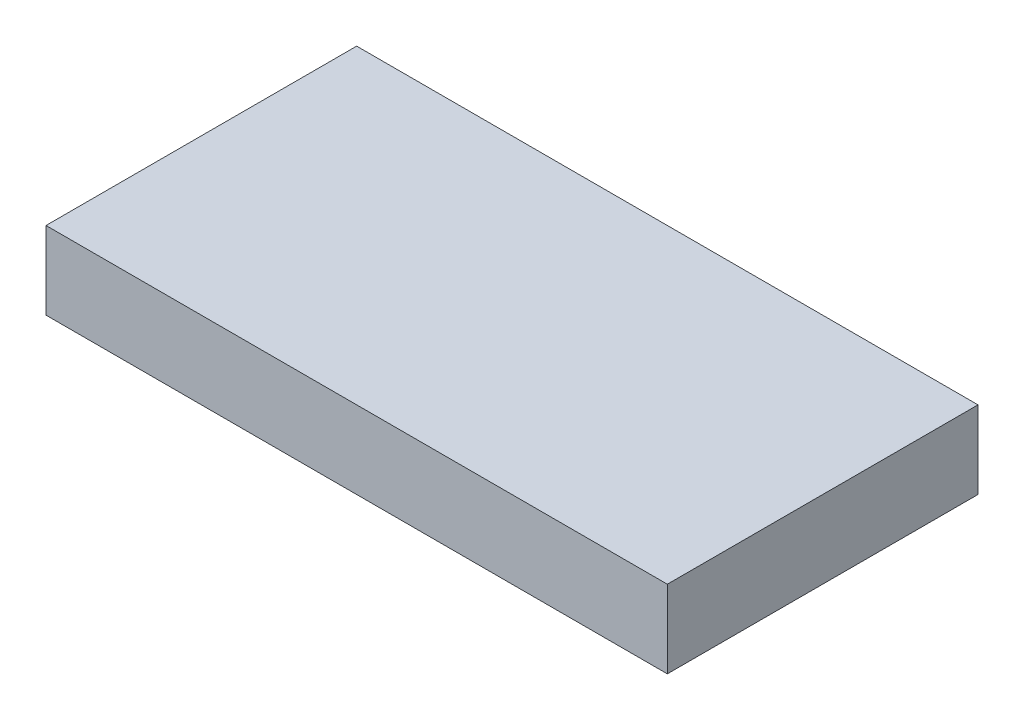
ISO-10303-21;
HEADER;
FILE_DESCRIPTION(('STEP AP214'),'2;1');
FILE_NAME('part.step','',(''),(''),'','','');
FILE_SCHEMA(('AUTOMOTIVE_DESIGN { 1 0 10303 214 1 1 1 1 }'));
ENDSEC;
DATA;
#1=APPLICATION_CONTEXT('core data for automotive mechanical design processes');
#2=APPLICATION_PROTOCOL_DEFINITION('international standard','automotive_design',2000,#1);
#3=PRODUCT_CONTEXT('',#1,'mechanical');
#4=PRODUCT('Part','Part','',(#3));
#5=PRODUCT_RELATED_PRODUCT_CATEGORY('part','',(#4));
#6=PRODUCT_DEFINITION_FORMATION('','',#4);
#7=PRODUCT_DEFINITION_CONTEXT('part definition',#1,'design');
#8=PRODUCT_DEFINITION('design','',#6,#7);
#9=PRODUCT_DEFINITION_SHAPE('','',#8);
#10=(LENGTH_UNIT() NAMED_UNIT(*) SI_UNIT(.MILLI.,.METRE.));
#11=(NAMED_UNIT(*) PLANE_ANGLE_UNIT() SI_UNIT($,.RADIAN.));
#12=(NAMED_UNIT(*) SI_UNIT($,.STERADIAN.) SOLID_ANGLE_UNIT());
#13=UNCERTAINTY_MEASURE_WITH_UNIT(LENGTH_MEASURE(1.E-05),#10,'distance_accuracy_value','');
#14=(GEOMETRIC_REPRESENTATION_CONTEXT(3) GLOBAL_UNCERTAINTY_ASSIGNED_CONTEXT((#13)) GLOBAL_UNIT_ASSIGNED_CONTEXT((#10,
#11,#12)) REPRESENTATION_CONTEXT('',''));
#15=CARTESIAN_POINT('',(0.,0.,0.));
#16=DIRECTION('',(0.,0.,1.));
#17=DIRECTION('',(1.,0.,0.));
#18=AXIS2_PLACEMENT_3D('',#15,#16,#17);
#19=CARTESIAN_POINT('',(-29.2546583850932,5.,-7.32919254658385));
#20=DIRECTION('',(1.,0.,0.));
#21=DIRECTION('',(0.,0.,-1.));
#22=AXIS2_PLACEMENT_3D('',#19,#20,#21);
#23=PLANE('',#22);
#24=DIRECTION('',(0.,0.,1.));
#25=VECTOR('',#24,1.);
#26=CARTESIAN_POINT('',(-29.2546583850932,0.,-7.32919254658385));
#27=LINE('',#26,#25);
#28=CARTESIAN_POINT('',(-29.2546583850932,0.,-7.32919254658385));
#29=VERTEX_POINT('',#28);
#30=CARTESIAN_POINT('',(-29.2546583850932,0.,12.6708074534161));
#31=VERTEX_POINT('',#30);
#32=EDGE_CURVE('E100',#29,#31,#27,.T.);
#33=ORIENTED_EDGE('',*,*,#32,.T.);
#34=DIRECTION('',(0.,-1.,0.));
#35=VECTOR('',#34,1.);
#36=CARTESIAN_POINT('',(-29.2546583850932,5.,12.6708074534161));
#37=LINE('',#36,#35);
#38=CARTESIAN_POINT('',(-29.2546583850932,5.,12.6708074534161));
#39=VERTEX_POINT('',#38);
#40=EDGE_CURVE('E11',#39,#31,#37,.T.);
#41=ORIENTED_EDGE('',*,*,#40,.F.);
#42=DIRECTION('',(0.,0.,1.));
#43=VECTOR('',#42,1.);
#44=CARTESIAN_POINT('',(-29.2546583850932,5.,-7.32919254658385));
#45=LINE('',#44,#43);
#46=CARTESIAN_POINT('',(-29.2546583850932,5.,-7.32919254658385));
#47=VERTEX_POINT('',#46);
#48=EDGE_CURVE('E88',#47,#39,#45,.T.);
#49=ORIENTED_EDGE('',*,*,#48,.F.);
#50=DIRECTION('',(0.,-1.,0.));
#51=VECTOR('',#50,1.);
#52=CARTESIAN_POINT('',(-29.2546583850932,5.,-7.32919254658385));
#53=LINE('',#52,#51);
#54=EDGE_CURVE('E96',#47,#29,#53,.T.);
#55=ORIENTED_EDGE('',*,*,#54,.T.);
#56=EDGE_LOOP('',(#33,#41,#49,#55));
#57=FACE_BOUND('',#56,.T.);
#58=ADVANCED_FACE('F37',(#57),#23,.F.);
#59=CARTESIAN_POINT('',(-29.2546583850932,5.,12.6708074534161));
#60=DIRECTION('',(0.,0.,-1.));
#61=DIRECTION('',(-1.,0.,0.));
#62=AXIS2_PLACEMENT_3D('',#59,#60,#61);
#63=PLANE('',#62);
#64=DIRECTION('',(1.,0.,0.));
#65=VECTOR('',#64,1.);
#66=CARTESIAN_POINT('',(-29.2546583850932,0.,12.6708074534161));
#67=LINE('',#66,#65);
#68=CARTESIAN_POINT('',(10.7453416149068,0.,12.6708074534161));
#69=VERTEX_POINT('',#68);
#70=EDGE_CURVE('E92',#31,#69,#67,.T.);
#71=ORIENTED_EDGE('',*,*,#70,.T.);
#72=DIRECTION('',(0.,-1.,0.));
#73=VECTOR('',#72,1.);
#74=CARTESIAN_POINT('',(10.7453416149068,5.,12.6708074534161));
#75=LINE('',#74,#73);
#76=CARTESIAN_POINT('',(10.7453416149068,5.,12.6708074534161));
#77=VERTEX_POINT('',#76);
#78=EDGE_CURVE('E45',#77,#69,#75,.T.);
#79=ORIENTED_EDGE('',*,*,#78,.F.);
#80=DIRECTION('',(1.,0.,0.));
#81=VECTOR('',#80,1.);
#82=CARTESIAN_POINT('',(-29.2546583850932,5.,12.6708074534161));
#83=LINE('',#82,#81);
#84=EDGE_CURVE('E83',#39,#77,#83,.T.);
#85=ORIENTED_EDGE('',*,*,#84,.F.);
#86=ORIENTED_EDGE('',*,*,#40,.T.);
#87=EDGE_LOOP('',(#71,#79,#85,#86));
#88=FACE_BOUND('',#87,.T.);
#89=ADVANCED_FACE('F91',(#88),#63,.F.);
#90=CARTESIAN_POINT('',(10.7453416149068,5.,-7.32919254658385));
#91=DIRECTION('',(-1.,0.,0.));
#92=DIRECTION('',(0.,0.,1.));
#93=AXIS2_PLACEMENT_3D('',#90,#91,#92);
#94=PLANE('',#93);
#95=DIRECTION('',(0.,0.,-1.));
#96=VECTOR('',#95,1.);
#97=CARTESIAN_POINT('',(10.7453416149068,0.,-7.32919254658385));
#98=LINE('',#97,#96);
#99=CARTESIAN_POINT('',(10.7453416149068,0.,-7.32919254658385));
#100=VERTEX_POINT('',#99);
#101=EDGE_CURVE('E70',#69,#100,#98,.T.);
#102=ORIENTED_EDGE('',*,*,#101,.T.);
#103=DIRECTION('',(0.,-1.,0.));
#104=VECTOR('',#103,1.);
#105=CARTESIAN_POINT('',(10.7453416149068,5.,-7.32919254658385));
#106=LINE('',#105,#104);
#107=CARTESIAN_POINT('',(10.7453416149068,5.,-7.32919254658385));
#108=VERTEX_POINT('',#107);
#109=EDGE_CURVE('E93',#108,#100,#106,.T.);
#110=ORIENTED_EDGE('',*,*,#109,.F.);
#111=DIRECTION('',(0.,0.,-1.));
#112=VECTOR('',#111,1.);
#113=CARTESIAN_POINT('',(10.7453416149068,5.,-7.32919254658385));
#114=LINE('',#113,#112);
#115=EDGE_CURVE('E86',#77,#108,#114,.T.);
#116=ORIENTED_EDGE('',*,*,#115,.F.);
#117=ORIENTED_EDGE('',*,*,#78,.T.);
#118=EDGE_LOOP('',(#102,#110,#116,#117));
#119=FACE_BOUND('',#118,.T.);
#120=ADVANCED_FACE('F94',(#119),#94,.F.);
#121=CARTESIAN_POINT('',(-29.2546583850932,5.,-7.32919254658385));
#122=DIRECTION('',(0.,0.,1.));
#123=DIRECTION('',(1.,0.,0.));
#124=AXIS2_PLACEMENT_3D('',#121,#122,#123);
#125=PLANE('',#124);
#126=DIRECTION('',(-1.,0.,0.));
#127=VECTOR('',#126,1.);
#128=CARTESIAN_POINT('',(-29.2546583850932,0.,-7.32919254658385));
#129=LINE('',#128,#127);
#130=EDGE_CURVE('E76',#100,#29,#129,.T.);
#131=ORIENTED_EDGE('',*,*,#130,.T.);
#132=ORIENTED_EDGE('',*,*,#54,.F.);
#133=DIRECTION('',(-1.,0.,0.));
#134=VECTOR('',#133,1.);
#135=CARTESIAN_POINT('',(-29.2546583850932,5.,-7.32919254658385));
#136=LINE('',#135,#134);
#137=EDGE_CURVE('E53',#108,#47,#136,.T.);
#138=ORIENTED_EDGE('',*,*,#137,.F.);
#139=ORIENTED_EDGE('',*,*,#109,.T.);
#140=EDGE_LOOP('',(#131,#132,#138,#139));
#141=FACE_BOUND('',#140,.T.);
#142=ADVANCED_FACE('F107',(#141),#125,.F.);
#143=CARTESIAN_POINT('',(0.,5.,0.));
#144=DIRECTION('',(0.,1.,0.));
#145=DIRECTION('',(0.,0.,1.));
#146=AXIS2_PLACEMENT_3D('',#143,#144,#145);
#147=PLANE('',#146);
#148=ORIENTED_EDGE('',*,*,#48,.T.);
#149=ORIENTED_EDGE('',*,*,#84,.T.);
#150=ORIENTED_EDGE('',*,*,#115,.T.);
#151=ORIENTED_EDGE('',*,*,#137,.T.);
#152=EDGE_LOOP('',(#148,#149,#150,#151));
#153=FACE_BOUND('',#152,.T.);
#154=ADVANCED_FACE('F84',(#153),#147,.T.);
#155=CARTESIAN_POINT('',(0.,0.,0.));
#156=DIRECTION('',(0.,1.,0.));
#157=DIRECTION('',(0.,0.,1.));
#158=AXIS2_PLACEMENT_3D('',#155,#156,#157);
#159=PLANE('',#158);
#160=ORIENTED_EDGE('',*,*,#32,.F.);
#161=ORIENTED_EDGE('',*,*,#130,.F.);
#162=ORIENTED_EDGE('',*,*,#101,.F.);
#163=ORIENTED_EDGE('',*,*,#70,.F.);
#164=EDGE_LOOP('',(#160,#161,#162,#163));
#165=FACE_BOUND('',#164,.T.);
#166=ADVANCED_FACE('F110',(#165),#159,.F.);
#167=CLOSED_SHELL('',(#58,#89,#120,#142,#154,#166));
#168=MANIFOLD_SOLID_BREP('B2',#167);
#169=ADVANCED_BREP_SHAPE_REPRESENTATION('',(#18,#168),#14);
#170=SHAPE_DEFINITION_REPRESENTATION(#9,#169);
ENDSEC;
END-ISO-10303-21;
